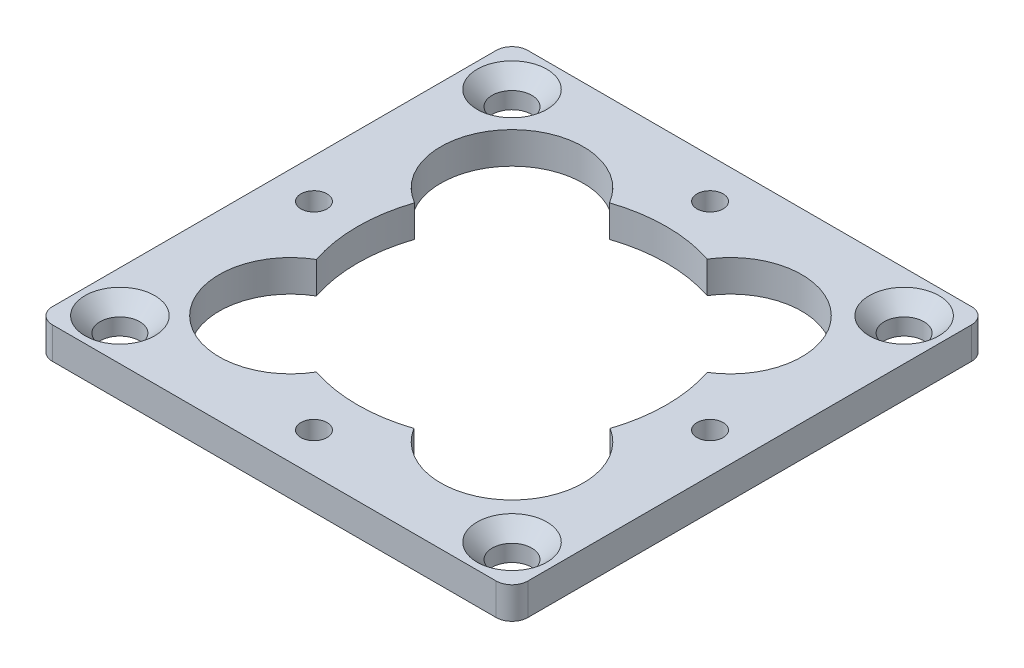
ISO-10303-21;
HEADER;
FILE_DESCRIPTION(('STEP AP214'),'2;1');
FILE_NAME('part.step','',(''),(''),'','','');
FILE_SCHEMA(('AUTOMOTIVE_DESIGN { 1 0 10303 214 1 1 1 1 }'));
ENDSEC;
DATA;
#1=APPLICATION_CONTEXT('core data for automotive mechanical design processes');
#2=APPLICATION_PROTOCOL_DEFINITION('international standard','automotive_design',2000,#1);
#3=PRODUCT_CONTEXT('',#1,'mechanical');
#4=PRODUCT('Part','Part','',(#3));
#5=PRODUCT_RELATED_PRODUCT_CATEGORY('part','',(#4));
#6=PRODUCT_DEFINITION_FORMATION('','',#4);
#7=PRODUCT_DEFINITION_CONTEXT('part definition',#1,'design');
#8=PRODUCT_DEFINITION('design','',#6,#7);
#9=PRODUCT_DEFINITION_SHAPE('','',#8);
#10=(LENGTH_UNIT() NAMED_UNIT(*) SI_UNIT(.MILLI.,.METRE.));
#11=(NAMED_UNIT(*) PLANE_ANGLE_UNIT() SI_UNIT($,.RADIAN.));
#12=(NAMED_UNIT(*) SI_UNIT($,.STERADIAN.) SOLID_ANGLE_UNIT());
#13=UNCERTAINTY_MEASURE_WITH_UNIT(LENGTH_MEASURE(1.E-05),#10,'distance_accuracy_value','');
#14=(GEOMETRIC_REPRESENTATION_CONTEXT(3) GLOBAL_UNCERTAINTY_ASSIGNED_CONTEXT((#13)) GLOBAL_UNIT_ASSIGNED_CONTEXT((#10,
#11,#12)) REPRESENTATION_CONTEXT('',''));
#15=CARTESIAN_POINT('',(0.,0.,0.));
#16=DIRECTION('',(0.,0.,1.));
#17=DIRECTION('',(1.,0.,0.));
#18=AXIS2_PLACEMENT_3D('',#15,#16,#17);
#19=CARTESIAN_POINT('',(-38.705299467486,4.,26.2189672025911));
#20=DIRECTION('',(0.,1.,0.));
#21=DIRECTION('',(0.,0.,1.));
#22=AXIS2_PLACEMENT_3D('',#19,#20,#21);
#23=PLANE('',#22);
#24=CARTESIAN_POINT('',(16.0434378740432,4.,20.9677045441202));
#25=DIRECTION('',(0.,1.,0.));
#26=DIRECTION('',(0.,0.,1.));
#27=AXIS2_PLACEMENT_3D('',#24,#25,#26);
#28=CIRCLE('',#27,4.39999999999999);
#29=CARTESIAN_POINT('',(16.0434378740432,4.,25.3677045441202));
#30=VERTEX_POINT('',#29);
#31=EDGE_CURVE('E300',#30,#30,#28,.F.);
#32=ORIENTED_EDGE('',*,*,#31,.T.);
#33=EDGE_LOOP('',(#32));
#34=FACE_BOUND('',#33,.T.);
#35=CARTESIAN_POINT('',(16.0434378740432,4.,-28.529770138938));
#36=DIRECTION('',(0.,1.,0.));
#37=DIRECTION('',(0.,0.,1.));
#38=AXIS2_PLACEMENT_3D('',#35,#36,#37);
#39=CIRCLE('',#38,4.40000000000001);
#40=CARTESIAN_POINT('',(16.0434378740432,4.,-24.129770138938));
#41=VERTEX_POINT('',#40);
#42=EDGE_CURVE('E297',#41,#41,#39,.F.);
#43=ORIENTED_EDGE('',*,*,#42,.T.);
#44=EDGE_LOOP('',(#43));
#45=FACE_BOUND('',#44,.T.);
#46=CARTESIAN_POINT('',(-33.4540368090152,4.,20.9677045441202));
#47=DIRECTION('',(0.,1.,0.));
#48=DIRECTION('',(0.,0.,1.));
#49=AXIS2_PLACEMENT_3D('',#46,#47,#48);
#50=CIRCLE('',#49,4.39999999999999);
#51=CARTESIAN_POINT('',(-33.4540368090152,4.,25.3677045441202));
#52=VERTEX_POINT('',#51);
#53=EDGE_CURVE('E294',#52,#52,#50,.F.);
#54=ORIENTED_EDGE('',*,*,#53,.T.);
#55=EDGE_LOOP('',(#54));
#56=FACE_BOUND('',#55,.T.);
#57=CARTESIAN_POINT('',(-33.4540368090153,4.,-28.529770138938));
#58=DIRECTION('',(0.,1.,0.));
#59=DIRECTION('',(0.,0.,1.));
#60=AXIS2_PLACEMENT_3D('',#57,#58,#59);
#61=CIRCLE('',#60,4.4);
#62=CARTESIAN_POINT('',(-33.4540368090153,4.,-24.129770138938));
#63=VERTEX_POINT('',#62);
#64=EDGE_CURVE('E291',#63,#63,#61,.F.);
#65=ORIENTED_EDGE('',*,*,#64,.T.);
#66=EDGE_LOOP('',(#65));
#67=FACE_BOUND('',#66,.T.);
#68=CARTESIAN_POINT('',(-8.70529946748604,4.,-28.7810327974089));
#69=DIRECTION('',(0.,1.,0.));
#70=DIRECTION('',(0.,0.,1.));
#71=AXIS2_PLACEMENT_3D('',#68,#69,#70);
#72=CIRCLE('',#71,1.65);
#73=CARTESIAN_POINT('',(-8.70529946748604,4.,-27.1310327974089));
#74=VERTEX_POINT('',#73);
#75=EDGE_CURVE('E410',#74,#74,#72,.T.);
#76=ORIENTED_EDGE('',*,*,#75,.F.);
#77=EDGE_LOOP('',(#76));
#78=FACE_BOUND('',#77,.T.);
#79=CARTESIAN_POINT('',(-33.705299467486,4.,-3.78103279740888));
#80=DIRECTION('',(0.,1.,0.));
#81=DIRECTION('',(0.,0.,1.));
#82=AXIS2_PLACEMENT_3D('',#79,#80,#81);
#83=CIRCLE('',#82,1.65);
#84=CARTESIAN_POINT('',(-33.705299467486,4.,-2.13103279740888));
#85=VERTEX_POINT('',#84);
#86=EDGE_CURVE('E191',#85,#85,#83,.T.);
#87=ORIENTED_EDGE('',*,*,#86,.F.);
#88=EDGE_LOOP('',(#87));
#89=FACE_BOUND('',#88,.T.);
#90=DIRECTION('',(-1.,0.,0.));
#91=VECTOR('',#90,1.);
#92=CARTESIAN_POINT('',(-38.705299467486,4.,-33.7810327974089));
#93=LINE('',#92,#91);
#94=CARTESIAN_POINT('',(19.2947005325139,4.,-33.7810327974089));
#95=VERTEX_POINT('',#94);
#96=CARTESIAN_POINT('',(-36.705299467486,4.,-33.7810327974089));
#97=VERTEX_POINT('',#96);
#98=EDGE_CURVE('E242',#95,#97,#93,.T.);
#99=ORIENTED_EDGE('',*,*,#98,.T.);
#100=CARTESIAN_POINT('',(-36.705299467486,4.,-31.7810327974089));
#101=DIRECTION('',(0.,1.,0.));
#102=DIRECTION('',(0.,0.,1.));
#103=AXIS2_PLACEMENT_3D('',#100,#101,#102);
#104=CIRCLE('',#103,2.);
#105=CARTESIAN_POINT('',(-38.705299467486,4.,-31.7810327974089));
#106=VERTEX_POINT('',#105);
#107=EDGE_CURVE('E277',#97,#106,#104,.T.);
#108=ORIENTED_EDGE('',*,*,#107,.T.);
#109=DIRECTION('',(0.,0.,1.));
#110=VECTOR('',#109,1.);
#111=CARTESIAN_POINT('',(-38.705299467486,4.,-33.7810327974089));
#112=LINE('',#111,#110);
#113=CARTESIAN_POINT('',(-38.705299467486,4.,24.2189672025911));
#114=VERTEX_POINT('',#113);
#115=EDGE_CURVE('E234',#106,#114,#112,.T.);
#116=ORIENTED_EDGE('',*,*,#115,.T.);
#117=CARTESIAN_POINT('',(-36.705299467486,4.,24.2189672025911));
#118=DIRECTION('',(0.,1.,0.));
#119=DIRECTION('',(0.,0.,1.));
#120=AXIS2_PLACEMENT_3D('',#117,#118,#119);
#121=CIRCLE('',#120,2.);
#122=CARTESIAN_POINT('',(-36.705299467486,4.,26.2189672025911));
#123=VERTEX_POINT('',#122);
#124=EDGE_CURVE('E272',#114,#123,#121,.T.);
#125=ORIENTED_EDGE('',*,*,#124,.T.);
#126=DIRECTION('',(1.,0.,0.));
#127=VECTOR('',#126,1.);
#128=CARTESIAN_POINT('',(-38.705299467486,4.,26.2189672025911));
#129=LINE('',#128,#127);
#130=CARTESIAN_POINT('',(19.294700532514,4.,26.2189672025911));
#131=VERTEX_POINT('',#130);
#132=EDGE_CURVE('E237',#123,#131,#129,.T.);
#133=ORIENTED_EDGE('',*,*,#132,.T.);
#134=CARTESIAN_POINT('',(19.294700532514,4.,24.2189672025911));
#135=DIRECTION('',(0.,1.,0.));
#136=DIRECTION('',(0.,0.,1.));
#137=AXIS2_PLACEMENT_3D('',#134,#135,#136);
#138=CIRCLE('',#137,2.);
#139=CARTESIAN_POINT('',(21.294700532514,4.,24.2189672025911));
#140=VERTEX_POINT('',#139);
#141=EDGE_CURVE('E55',#131,#140,#138,.T.);
#142=ORIENTED_EDGE('',*,*,#141,.T.);
#143=DIRECTION('',(0.,0.,-1.));
#144=VECTOR('',#143,1.);
#145=CARTESIAN_POINT('',(21.294700532514,4.,-33.7810327974089));
#146=LINE('',#145,#144);
#147=CARTESIAN_POINT('',(21.294700532514,4.,-31.7810327974089));
#148=VERTEX_POINT('',#147);
#149=EDGE_CURVE('E240',#140,#148,#146,.T.);
#150=ORIENTED_EDGE('',*,*,#149,.T.);
#151=CARTESIAN_POINT('',(19.2947005325139,4.,-31.7810327974089));
#152=DIRECTION('',(0.,1.,0.));
#153=DIRECTION('',(0.,0.,1.));
#154=AXIS2_PLACEMENT_3D('',#151,#152,#153);
#155=CIRCLE('',#154,2.);
#156=EDGE_CURVE('E275',#148,#95,#155,.T.);
#157=ORIENTED_EDGE('',*,*,#156,.T.);
#158=EDGE_LOOP('',(#99,#108,#116,#125,#133,#142,#150,#157));
#159=FACE_BOUND('',#158,.T.);
#160=CARTESIAN_POINT('',(-22.6886835294264,4.,-17.764416859349));
#161=DIRECTION('',(0.,1.,0.));
#162=DIRECTION('',(0.,0.,1.));
#163=AXIS2_PLACEMENT_3D('',#160,#161,#162);
#164=CIRCLE('',#163,9.);
#165=CARTESIAN_POINT('',(-14.8984999863531,4.,-22.2714159014201));
#166=VERTEX_POINT('',#165);
#167=CARTESIAN_POINT('',(-27.1956825714974,4.,-9.97423331627569));
#168=VERTEX_POINT('',#167);
#169=EDGE_CURVE('E159',#166,#168,#164,.T.);
#170=ORIENTED_EDGE('',*,*,#169,.F.);
#171=CARTESIAN_POINT('',(-8.70529946748604,4.,-3.78103279740888));
#172=DIRECTION('',(0.,1.,0.));
#173=DIRECTION('',(0.,0.,1.));
#174=AXIS2_PLACEMENT_3D('',#171,#172,#173);
#175=CIRCLE('',#174,19.5);
#176=CARTESIAN_POINT('',(-2.57751187142757,4.,-22.2931968842355));
#177=VERTEX_POINT('',#176);
#178=EDGE_CURVE('E149',#177,#166,#175,.T.);
#179=ORIENTED_EDGE('',*,*,#178,.F.);
#180=CARTESIAN_POINT('',(5.08328276565161,4.,-17.5696150305466));
#181=DIRECTION('',(0.,1.,0.));
#182=DIRECTION('',(0.,0.,1.));
#183=AXIS2_PLACEMENT_3D('',#180,#181,#182);
#184=CIRCLE('',#183,9.);
#185=CARTESIAN_POINT('',(9.80686461934051,4.,-9.90882039346742));
#186=VERTEX_POINT('',#185);
#187=EDGE_CURVE('E187',#186,#177,#184,.T.);
#188=ORIENTED_EDGE('',*,*,#187,.F.);
#189=CARTESIAN_POINT('',(-8.70529946748604,4.,-3.78103279740888));
#190=DIRECTION('',(0.,1.,0.));
#191=DIRECTION('',(0.,0.,1.));
#192=AXIS2_PLACEMENT_3D('',#189,#190,#191);
#193=CIRCLE('',#192,19.5);
#194=CARTESIAN_POINT('',(9.80686461934056,4.,2.34675479864952));
#195=VERTEX_POINT('',#194);
#196=EDGE_CURVE('E184',#195,#186,#193,.T.);
#197=ORIENTED_EDGE('',*,*,#196,.F.);
#198=CARTESIAN_POINT('',(5.08328276565171,4.,10.0075494357287));
#199=DIRECTION('',(0.,1.,0.));
#200=DIRECTION('',(0.,0.,1.));
#201=AXIS2_PLACEMENT_3D('',#198,#199,#200);
#202=CIRCLE('',#201,9.);
#203=CARTESIAN_POINT('',(-2.57751187142744,4.,14.7311312894177));
#204=VERTEX_POINT('',#203);
#205=EDGE_CURVE('E182',#204,#195,#202,.T.);
#206=ORIENTED_EDGE('',*,*,#205,.F.);
#207=CARTESIAN_POINT('',(-8.70529946748604,4.,-3.78103279740888));
#208=DIRECTION('',(0.,1.,0.));
#209=DIRECTION('',(0.,0.,1.));
#210=AXIS2_PLACEMENT_3D('',#207,#208,#209);
#211=CIRCLE('',#210,19.5);
#212=CARTESIAN_POINT('',(-14.8984999863529,4.,14.7093503066024));
#213=VERTEX_POINT('',#212);
#214=EDGE_CURVE('E180',#213,#204,#211,.T.);
#215=ORIENTED_EDGE('',*,*,#214,.F.);
#216=CARTESIAN_POINT('',(-22.6886835294263,4.,10.2023512645314));
#217=DIRECTION('',(0.,1.,0.));
#218=DIRECTION('',(0.,0.,1.));
#219=AXIS2_PLACEMENT_3D('',#216,#217,#218);
#220=CIRCLE('',#219,9.);
#221=CARTESIAN_POINT('',(-27.1956825714973,4.,2.41216772145806));
#222=VERTEX_POINT('',#221);
#223=EDGE_CURVE('E175',#222,#213,#220,.T.);
#224=ORIENTED_EDGE('',*,*,#223,.F.);
#225=CARTESIAN_POINT('',(-8.70529946748604,4.,-3.78103279740888));
#226=DIRECTION('',(0.,1.,0.));
#227=DIRECTION('',(0.,0.,1.));
#228=AXIS2_PLACEMENT_3D('',#225,#226,#227);
#229=CIRCLE('',#228,19.5);
#230=EDGE_CURVE('E173',#168,#222,#229,.T.);
#231=ORIENTED_EDGE('',*,*,#230,.F.);
#232=EDGE_LOOP('',(#170,#179,#188,#197,#206,#215,#224,#231));
#233=FACE_BOUND('',#232,.T.);
#234=CARTESIAN_POINT('',(16.294700532514,4.,-3.78103279740888));
#235=DIRECTION('',(0.,1.,0.));
#236=DIRECTION('',(0.,0.,1.));
#237=AXIS2_PLACEMENT_3D('',#234,#235,#236);
#238=CIRCLE('',#237,1.65);
#239=CARTESIAN_POINT('',(16.294700532514,4.,-2.13103279740888));
#240=VERTEX_POINT('',#239);
#241=EDGE_CURVE('E415',#240,#240,#238,.T.);
#242=ORIENTED_EDGE('',*,*,#241,.F.);
#243=EDGE_LOOP('',(#242));
#244=FACE_BOUND('',#243,.T.);
#245=CARTESIAN_POINT('',(-8.70529946748604,4.,21.2189672025911));
#246=DIRECTION('',(0.,1.,0.));
#247=DIRECTION('',(0.,0.,1.));
#248=AXIS2_PLACEMENT_3D('',#245,#246,#247);
#249=CIRCLE('',#248,1.65);
#250=CARTESIAN_POINT('',(-8.70529946748604,4.,22.8689672025911));
#251=VERTEX_POINT('',#250);
#252=EDGE_CURVE('E404',#251,#251,#249,.T.);
#253=ORIENTED_EDGE('',*,*,#252,.F.);
#254=EDGE_LOOP('',(#253));
#255=FACE_BOUND('',#254,.T.);
#256=ADVANCED_FACE('F33',(#34,#45,#56,#67,#78,#89,#159,#233,#244,#255),#23,.T.);
#257=CARTESIAN_POINT('',(-38.705299467486,0.,26.2189672025911));
#258=DIRECTION('',(0.,1.,0.));
#259=DIRECTION('',(0.,0.,1.));
#260=AXIS2_PLACEMENT_3D('',#257,#258,#259);
#261=PLANE('',#260);
#262=CARTESIAN_POINT('',(-8.70529946748604,0.,-28.7810327974089));
#263=DIRECTION('',(0.,1.,0.));
#264=DIRECTION('',(0.,0.,1.));
#265=AXIS2_PLACEMENT_3D('',#262,#263,#264);
#266=CIRCLE('',#265,1.65);
#267=CARTESIAN_POINT('',(-8.70529946748604,0.,-27.1310327974089));
#268=VERTEX_POINT('',#267);
#269=EDGE_CURVE('E407',#268,#268,#266,.T.);
#270=ORIENTED_EDGE('',*,*,#269,.T.);
#271=EDGE_LOOP('',(#270));
#272=FACE_BOUND('',#271,.T.);
#273=CARTESIAN_POINT('',(-33.705299467486,0.,-3.78103279740888));
#274=DIRECTION('',(0.,1.,0.));
#275=DIRECTION('',(0.,0.,1.));
#276=AXIS2_PLACEMENT_3D('',#273,#274,#275);
#277=CIRCLE('',#276,1.65);
#278=CARTESIAN_POINT('',(-33.705299467486,0.,-2.13103279740888));
#279=VERTEX_POINT('',#278);
#280=EDGE_CURVE('E418',#279,#279,#277,.T.);
#281=ORIENTED_EDGE('',*,*,#280,.T.);
#282=EDGE_LOOP('',(#281));
#283=FACE_BOUND('',#282,.T.);
#284=CARTESIAN_POINT('',(16.0434378740432,0.,20.9677045441202));
#285=DIRECTION('',(0.,1.,0.));
#286=DIRECTION('',(0.,0.,1.));
#287=AXIS2_PLACEMENT_3D('',#284,#285,#286);
#288=CIRCLE('',#287,2.49999999999999);
#289=CARTESIAN_POINT('',(16.0434378740432,0.,23.4677045441202));
#290=VERTEX_POINT('',#289);
#291=EDGE_CURVE('E167',#290,#290,#288,.T.);
#292=ORIENTED_EDGE('',*,*,#291,.T.);
#293=EDGE_LOOP('',(#292));
#294=FACE_BOUND('',#293,.T.);
#295=CARTESIAN_POINT('',(16.0434378740432,0.,-28.529770138938));
#296=DIRECTION('',(0.,1.,0.));
#297=DIRECTION('',(0.,0.,1.));
#298=AXIS2_PLACEMENT_3D('',#295,#296,#297);
#299=CIRCLE('',#298,2.50000000000001);
#300=CARTESIAN_POINT('',(16.0434378740432,0.,-26.029770138938));
#301=VERTEX_POINT('',#300);
#302=EDGE_CURVE('E227',#301,#301,#299,.T.);
#303=ORIENTED_EDGE('',*,*,#302,.T.);
#304=EDGE_LOOP('',(#303));
#305=FACE_BOUND('',#304,.T.);
#306=DIRECTION('',(0.,0.,1.));
#307=VECTOR('',#306,1.);
#308=CARTESIAN_POINT('',(-38.705299467486,0.,-33.7810327974089));
#309=LINE('',#308,#307);
#310=CARTESIAN_POINT('',(-38.705299467486,0.,-31.7810327974089));
#311=VERTEX_POINT('',#310);
#312=CARTESIAN_POINT('',(-38.705299467486,0.,24.2189672025911));
#313=VERTEX_POINT('',#312);
#314=EDGE_CURVE('E233',#311,#313,#309,.T.);
#315=ORIENTED_EDGE('',*,*,#314,.F.);
#316=CARTESIAN_POINT('',(-36.705299467486,0.,-31.7810327974089));
#317=DIRECTION('',(0.,1.,0.));
#318=DIRECTION('',(0.,0.,1.));
#319=AXIS2_PLACEMENT_3D('',#316,#317,#318);
#320=CIRCLE('',#319,2.);
#321=CARTESIAN_POINT('',(-36.705299467486,0.,-33.7810327974089));
#322=VERTEX_POINT('',#321);
#323=EDGE_CURVE('E265',#311,#322,#320,.F.);
#324=ORIENTED_EDGE('',*,*,#323,.T.);
#325=DIRECTION('',(-1.,0.,0.));
#326=VECTOR('',#325,1.);
#327=CARTESIAN_POINT('',(-38.705299467486,0.,-33.7810327974089));
#328=LINE('',#327,#326);
#329=CARTESIAN_POINT('',(19.2947005325139,0.,-33.7810327974089));
#330=VERTEX_POINT('',#329);
#331=EDGE_CURVE('E238',#330,#322,#328,.T.);
#332=ORIENTED_EDGE('',*,*,#331,.F.);
#333=CARTESIAN_POINT('',(19.2947005325139,0.,-31.7810327974089));
#334=DIRECTION('',(0.,1.,0.));
#335=DIRECTION('',(0.,0.,1.));
#336=AXIS2_PLACEMENT_3D('',#333,#334,#335);
#337=CIRCLE('',#336,2.);
#338=CARTESIAN_POINT('',(21.294700532514,0.,-31.7810327974089));
#339=VERTEX_POINT('',#338);
#340=EDGE_CURVE('E263',#330,#339,#337,.F.);
#341=ORIENTED_EDGE('',*,*,#340,.T.);
#342=DIRECTION('',(0.,0.,-1.));
#343=VECTOR('',#342,1.);
#344=CARTESIAN_POINT('',(21.294700532514,0.,-33.7810327974089));
#345=LINE('',#344,#343);
#346=CARTESIAN_POINT('',(21.294700532514,0.,24.2189672025911));
#347=VERTEX_POINT('',#346);
#348=EDGE_CURVE('E251',#347,#339,#345,.T.);
#349=ORIENTED_EDGE('',*,*,#348,.F.);
#350=CARTESIAN_POINT('',(19.294700532514,0.,24.2189672025911));
#351=DIRECTION('',(0.,1.,0.));
#352=DIRECTION('',(0.,0.,1.));
#353=AXIS2_PLACEMENT_3D('',#350,#351,#352);
#354=CIRCLE('',#353,2.);
#355=CARTESIAN_POINT('',(19.294700532514,0.,26.2189672025911));
#356=VERTEX_POINT('',#355);
#357=EDGE_CURVE('E261',#347,#356,#354,.F.);
#358=ORIENTED_EDGE('',*,*,#357,.T.);
#359=DIRECTION('',(1.,0.,0.));
#360=VECTOR('',#359,1.);
#361=CARTESIAN_POINT('',(-38.705299467486,0.,26.2189672025911));
#362=LINE('',#361,#360);
#363=CARTESIAN_POINT('',(-36.705299467486,0.,26.2189672025911));
#364=VERTEX_POINT('',#363);
#365=EDGE_CURVE('E248',#364,#356,#362,.T.);
#366=ORIENTED_EDGE('',*,*,#365,.F.);
#367=CARTESIAN_POINT('',(-36.705299467486,0.,24.2189672025911));
#368=DIRECTION('',(0.,1.,0.));
#369=DIRECTION('',(0.,0.,1.));
#370=AXIS2_PLACEMENT_3D('',#367,#368,#369);
#371=CIRCLE('',#370,2.);
#372=EDGE_CURVE('E259',#364,#313,#371,.F.);
#373=ORIENTED_EDGE('',*,*,#372,.T.);
#374=EDGE_LOOP('',(#315,#324,#332,#341,#349,#358,#366,#373));
#375=FACE_BOUND('',#374,.T.);
#376=CARTESIAN_POINT('',(-33.4540368090153,0.,-28.529770138938));
#377=DIRECTION('',(0.,1.,0.));
#378=DIRECTION('',(0.,0.,1.));
#379=AXIS2_PLACEMENT_3D('',#376,#377,#378);
#380=CIRCLE('',#379,2.5);
#381=CARTESIAN_POINT('',(-33.4540368090153,0.,-26.029770138938));
#382=VERTEX_POINT('',#381);
#383=EDGE_CURVE('E230',#382,#382,#380,.T.);
#384=ORIENTED_EDGE('',*,*,#383,.T.);
#385=EDGE_LOOP('',(#384));
#386=FACE_BOUND('',#385,.T.);
#387=CARTESIAN_POINT('',(-33.4540368090152,0.,20.9677045441202));
#388=DIRECTION('',(0.,1.,0.));
#389=DIRECTION('',(0.,0.,1.));
#390=AXIS2_PLACEMENT_3D('',#387,#388,#389);
#391=CIRCLE('',#390,2.49999999999999);
#392=CARTESIAN_POINT('',(-33.4540368090152,0.,23.4677045441202));
#393=VERTEX_POINT('',#392);
#394=EDGE_CURVE('E224',#393,#393,#391,.T.);
#395=ORIENTED_EDGE('',*,*,#394,.T.);
#396=EDGE_LOOP('',(#395));
#397=FACE_BOUND('',#396,.T.);
#398=CARTESIAN_POINT('',(-8.70529946748604,0.,-3.78103279740888));
#399=DIRECTION('',(0.,1.,0.));
#400=DIRECTION('',(0.,0.,1.));
#401=AXIS2_PLACEMENT_3D('',#398,#399,#400);
#402=CIRCLE('',#401,19.5);
#403=CARTESIAN_POINT('',(-2.57751187142757,0.,-22.2931968842355));
#404=VERTEX_POINT('',#403);
#405=CARTESIAN_POINT('',(-14.8984999863531,0.,-22.2714159014201));
#406=VERTEX_POINT('',#405);
#407=EDGE_CURVE('E189',#404,#406,#402,.T.);
#408=ORIENTED_EDGE('',*,*,#407,.T.);
#409=CARTESIAN_POINT('',(-22.6886835294264,0.,-17.764416859349));
#410=DIRECTION('',(0.,1.,0.));
#411=DIRECTION('',(0.,0.,1.));
#412=AXIS2_PLACEMENT_3D('',#409,#410,#411);
#413=CIRCLE('',#412,9.);
#414=CARTESIAN_POINT('',(-27.1956825714974,0.,-9.97423331627569));
#415=VERTEX_POINT('',#414);
#416=EDGE_CURVE('E166',#406,#415,#413,.T.);
#417=ORIENTED_EDGE('',*,*,#416,.T.);
#418=CARTESIAN_POINT('',(-8.70529946748604,0.,-3.78103279740888));
#419=DIRECTION('',(0.,1.,0.));
#420=DIRECTION('',(0.,0.,1.));
#421=AXIS2_PLACEMENT_3D('',#418,#419,#420);
#422=CIRCLE('',#421,19.5);
#423=CARTESIAN_POINT('',(-27.1956825714973,0.,2.41216772145806));
#424=VERTEX_POINT('',#423);
#425=EDGE_CURVE('E193',#415,#424,#422,.T.);
#426=ORIENTED_EDGE('',*,*,#425,.T.);
#427=CARTESIAN_POINT('',(-22.6886835294263,0.,10.2023512645314));
#428=DIRECTION('',(0.,1.,0.));
#429=DIRECTION('',(0.,0.,1.));
#430=AXIS2_PLACEMENT_3D('',#427,#428,#429);
#431=CIRCLE('',#430,9.);
#432=CARTESIAN_POINT('',(-14.8984999863529,0.,14.7093503066024));
#433=VERTEX_POINT('',#432);
#434=EDGE_CURVE('E196',#424,#433,#431,.T.);
#435=ORIENTED_EDGE('',*,*,#434,.T.);
#436=CARTESIAN_POINT('',(-8.70529946748604,0.,-3.78103279740888));
#437=DIRECTION('',(0.,1.,0.));
#438=DIRECTION('',(0.,0.,1.));
#439=AXIS2_PLACEMENT_3D('',#436,#437,#438);
#440=CIRCLE('',#439,19.5);
#441=CARTESIAN_POINT('',(-2.57751187142744,0.,14.7311312894177));
#442=VERTEX_POINT('',#441);
#443=EDGE_CURVE('E199',#433,#442,#440,.T.);
#444=ORIENTED_EDGE('',*,*,#443,.T.);
#445=CARTESIAN_POINT('',(5.08328276565171,0.,10.0075494357287));
#446=DIRECTION('',(0.,1.,0.));
#447=DIRECTION('',(0.,0.,1.));
#448=AXIS2_PLACEMENT_3D('',#445,#446,#447);
#449=CIRCLE('',#448,9.);
#450=CARTESIAN_POINT('',(9.80686461934056,0.,2.34675479864952));
#451=VERTEX_POINT('',#450);
#452=EDGE_CURVE('E202',#442,#451,#449,.T.);
#453=ORIENTED_EDGE('',*,*,#452,.T.);
#454=CARTESIAN_POINT('',(-8.70529946748604,0.,-3.78103279740888));
#455=DIRECTION('',(0.,1.,0.));
#456=DIRECTION('',(0.,0.,1.));
#457=AXIS2_PLACEMENT_3D('',#454,#455,#456);
#458=CIRCLE('',#457,19.5);
#459=CARTESIAN_POINT('',(9.80686461934051,0.,-9.90882039346742));
#460=VERTEX_POINT('',#459);
#461=EDGE_CURVE('E205',#451,#460,#458,.T.);
#462=ORIENTED_EDGE('',*,*,#461,.T.);
#463=CARTESIAN_POINT('',(5.08328276565161,0.,-17.5696150305466));
#464=DIRECTION('',(0.,1.,0.));
#465=DIRECTION('',(0.,0.,1.));
#466=AXIS2_PLACEMENT_3D('',#463,#464,#465);
#467=CIRCLE('',#466,9.);
#468=EDGE_CURVE('E160',#460,#404,#467,.T.);
#469=ORIENTED_EDGE('',*,*,#468,.T.);
#470=EDGE_LOOP('',(#408,#417,#426,#435,#444,#453,#462,#469));
#471=FACE_BOUND('',#470,.T.);
#472=CARTESIAN_POINT('',(16.294700532514,0.,-3.78103279740888));
#473=DIRECTION('',(0.,1.,0.));
#474=DIRECTION('',(0.,0.,1.));
#475=AXIS2_PLACEMENT_3D('',#472,#473,#474);
#476=CIRCLE('',#475,1.65);
#477=CARTESIAN_POINT('',(16.294700532514,0.,-2.13103279740888));
#478=VERTEX_POINT('',#477);
#479=EDGE_CURVE('E399',#478,#478,#476,.T.);
#480=ORIENTED_EDGE('',*,*,#479,.T.);
#481=EDGE_LOOP('',(#480));
#482=FACE_BOUND('',#481,.T.);
#483=CARTESIAN_POINT('',(-8.70529946748604,0.,21.2189672025911));
#484=DIRECTION('',(0.,1.,0.));
#485=DIRECTION('',(0.,0.,1.));
#486=AXIS2_PLACEMENT_3D('',#483,#484,#485);
#487=CIRCLE('',#486,1.65);
#488=CARTESIAN_POINT('',(-8.70529946748604,0.,22.8689672025911));
#489=VERTEX_POINT('',#488);
#490=EDGE_CURVE('E402',#489,#489,#487,.T.);
#491=ORIENTED_EDGE('',*,*,#490,.T.);
#492=EDGE_LOOP('',(#491));
#493=FACE_BOUND('',#492,.T.);
#494=ADVANCED_FACE('F325',(#272,#283,#294,#305,#375,#386,#397,#471,#482,#493),#261,.F.);
#495=CARTESIAN_POINT('',(-38.705299467486,4.,-33.7810327974089));
#496=DIRECTION('',(1.,0.,0.));
#497=DIRECTION('',(0.,0.,-1.));
#498=AXIS2_PLACEMENT_3D('',#495,#496,#497);
#499=PLANE('',#498);
#500=ORIENTED_EDGE('',*,*,#115,.F.);
#501=DIRECTION('',(0.,-1.,0.));
#502=VECTOR('',#501,1.);
#503=CARTESIAN_POINT('',(-38.705299467486,4.,-31.7810327974089));
#504=LINE('',#503,#502);
#505=EDGE_CURVE('E256',#106,#311,#504,.T.);
#506=ORIENTED_EDGE('',*,*,#505,.T.);
#507=ORIENTED_EDGE('',*,*,#314,.T.);
#508=DIRECTION('',(0.,-1.,0.));
#509=VECTOR('',#508,1.);
#510=CARTESIAN_POINT('',(-38.705299467486,4.,24.2189672025911));
#511=LINE('',#510,#509);
#512=EDGE_CURVE('E245',#313,#114,#511,.F.);
#513=ORIENTED_EDGE('',*,*,#512,.T.);
#514=EDGE_LOOP('',(#500,#506,#507,#513));
#515=FACE_BOUND('',#514,.T.);
#516=ADVANCED_FACE('F333',(#515),#499,.F.);
#517=CARTESIAN_POINT('',(-38.705299467486,4.,26.2189672025911));
#518=DIRECTION('',(0.,0.,-1.));
#519=DIRECTION('',(-1.,0.,0.));
#520=AXIS2_PLACEMENT_3D('',#517,#518,#519);
#521=PLANE('',#520);
#522=ORIENTED_EDGE('',*,*,#365,.T.);
#523=DIRECTION('',(0.,-1.,0.));
#524=VECTOR('',#523,1.);
#525=CARTESIAN_POINT('',(19.294700532514,4.,26.2189672025911));
#526=LINE('',#525,#524);
#527=EDGE_CURVE('E286',#356,#131,#526,.F.);
#528=ORIENTED_EDGE('',*,*,#527,.T.);
#529=ORIENTED_EDGE('',*,*,#132,.F.);
#530=DIRECTION('',(0.,-1.,0.));
#531=VECTOR('',#530,1.);
#532=CARTESIAN_POINT('',(-36.705299467486,4.,26.2189672025911));
#533=LINE('',#532,#531);
#534=EDGE_CURVE('E283',#123,#364,#533,.T.);
#535=ORIENTED_EDGE('',*,*,#534,.T.);
#536=EDGE_LOOP('',(#522,#528,#529,#535));
#537=FACE_BOUND('',#536,.T.);
#538=ADVANCED_FACE('F348',(#537),#521,.F.);
#539=CARTESIAN_POINT('',(21.294700532514,4.,-33.7810327974089));
#540=DIRECTION('',(-1.,0.,0.));
#541=DIRECTION('',(0.,0.,1.));
#542=AXIS2_PLACEMENT_3D('',#539,#540,#541);
#543=PLANE('',#542);
#544=ORIENTED_EDGE('',*,*,#348,.T.);
#545=DIRECTION('',(0.,-1.,0.));
#546=VECTOR('',#545,1.);
#547=CARTESIAN_POINT('',(21.294700532514,4.,-31.7810327974089));
#548=LINE('',#547,#546);
#549=EDGE_CURVE('E48',#339,#148,#548,.F.);
#550=ORIENTED_EDGE('',*,*,#549,.T.);
#551=ORIENTED_EDGE('',*,*,#149,.F.);
#552=DIRECTION('',(0.,-1.,0.));
#553=VECTOR('',#552,1.);
#554=CARTESIAN_POINT('',(21.294700532514,4.,24.2189672025911));
#555=LINE('',#554,#553);
#556=EDGE_CURVE('E279',#140,#347,#555,.T.);
#557=ORIENTED_EDGE('',*,*,#556,.T.);
#558=EDGE_LOOP('',(#544,#550,#551,#557));
#559=FACE_BOUND('',#558,.T.);
#560=ADVANCED_FACE('F344',(#559),#543,.F.);
#561=CARTESIAN_POINT('',(-38.705299467486,4.,-33.7810327974089));
#562=DIRECTION('',(0.,0.,1.));
#563=DIRECTION('',(1.,0.,0.));
#564=AXIS2_PLACEMENT_3D('',#561,#562,#563);
#565=PLANE('',#564);
#566=ORIENTED_EDGE('',*,*,#331,.T.);
#567=DIRECTION('',(0.,-1.,0.));
#568=VECTOR('',#567,1.);
#569=CARTESIAN_POINT('',(-36.705299467486,4.,-33.7810327974089));
#570=LINE('',#569,#568);
#571=EDGE_CURVE('E270',#322,#97,#570,.F.);
#572=ORIENTED_EDGE('',*,*,#571,.T.);
#573=ORIENTED_EDGE('',*,*,#98,.F.);
#574=DIRECTION('',(0.,-1.,0.));
#575=VECTOR('',#574,1.);
#576=CARTESIAN_POINT('',(19.2947005325139,4.,-33.7810327974089));
#577=LINE('',#576,#575);
#578=EDGE_CURVE('E267',#95,#330,#577,.T.);
#579=ORIENTED_EDGE('',*,*,#578,.T.);
#580=EDGE_LOOP('',(#566,#572,#573,#579));
#581=FACE_BOUND('',#580,.T.);
#582=ADVANCED_FACE('F341',(#581),#565,.F.);
#583=CARTESIAN_POINT('',(-33.4540368090153,4.,-28.529770138938));
#584=DIRECTION('',(0.,-1.,0.));
#585=DIRECTION('',(0.,0.,-1.));
#586=AXIS2_PLACEMENT_3D('',#583,#584,#585);
#587=CYLINDRICAL_SURFACE('',#586,2.5);
#588=CARTESIAN_POINT('',(-33.4540368090153,2.09999999999999,-28.529770138938));
#589=DIRECTION('',(0.,1.,0.));
#590=DIRECTION('',(0.,0.,1.));
#591=AXIS2_PLACEMENT_3D('',#588,#589,#590);
#592=CIRCLE('',#591,2.5);
#593=CARTESIAN_POINT('',(-33.4540368090153,2.09999999999999,-26.029770138938));
#594=VERTEX_POINT('',#593);
#595=EDGE_CURVE('E11',#594,#594,#592,.T.);
#596=ORIENTED_EDGE('',*,*,#595,.T.);
#597=EDGE_LOOP('',(#596));
#598=FACE_BOUND('',#597,.T.);
#599=ORIENTED_EDGE('',*,*,#383,.F.);
#600=EDGE_LOOP('',(#599));
#601=FACE_BOUND('',#600,.T.);
#602=ADVANCED_FACE('F338',(#598,#601),#587,.F.);
#603=CARTESIAN_POINT('',(16.0434378740432,4.,-28.529770138938));
#604=DIRECTION('',(0.,-1.,0.));
#605=DIRECTION('',(0.,0.,-1.));
#606=AXIS2_PLACEMENT_3D('',#603,#604,#605);
#607=CYLINDRICAL_SURFACE('',#606,2.50000000000001);
#608=CARTESIAN_POINT('',(16.0434378740432,2.1,-28.529770138938));
#609=DIRECTION('',(0.,1.,0.));
#610=DIRECTION('',(0.,0.,1.));
#611=AXIS2_PLACEMENT_3D('',#608,#609,#610);
#612=CIRCLE('',#611,2.50000000000001);
#613=CARTESIAN_POINT('',(16.0434378740432,2.1,-26.029770138938));
#614=VERTEX_POINT('',#613);
#615=EDGE_CURVE('E303',#614,#614,#612,.T.);
#616=ORIENTED_EDGE('',*,*,#615,.T.);
#617=EDGE_LOOP('',(#616));
#618=FACE_BOUND('',#617,.T.);
#619=ORIENTED_EDGE('',*,*,#302,.F.);
#620=EDGE_LOOP('',(#619));
#621=FACE_BOUND('',#620,.T.);
#622=ADVANCED_FACE('F467',(#618,#621),#607,.F.);
#623=CARTESIAN_POINT('',(-33.4540368090152,4.,20.9677045441202));
#624=DIRECTION('',(0.,-1.,0.));
#625=DIRECTION('',(0.,0.,-1.));
#626=AXIS2_PLACEMENT_3D('',#623,#624,#625);
#627=CYLINDRICAL_SURFACE('',#626,2.49999999999999);
#628=CARTESIAN_POINT('',(-33.4540368090152,2.1,20.9677045441202));
#629=DIRECTION('',(0.,1.,0.));
#630=DIRECTION('',(0.,0.,1.));
#631=AXIS2_PLACEMENT_3D('',#628,#629,#630);
#632=CIRCLE('',#631,2.49999999999999);
#633=CARTESIAN_POINT('',(-33.4540368090152,2.1,23.4677045441202));
#634=VERTEX_POINT('',#633);
#635=EDGE_CURVE('E41',#634,#634,#632,.T.);
#636=ORIENTED_EDGE('',*,*,#635,.T.);
#637=EDGE_LOOP('',(#636));
#638=FACE_BOUND('',#637,.T.);
#639=ORIENTED_EDGE('',*,*,#394,.F.);
#640=EDGE_LOOP('',(#639));
#641=FACE_BOUND('',#640,.T.);
#642=ADVANCED_FACE('F308',(#638,#641),#627,.F.);
#643=CARTESIAN_POINT('',(16.0434378740432,4.,20.9677045441202));
#644=DIRECTION('',(0.,-1.,0.));
#645=DIRECTION('',(0.,0.,-1.));
#646=AXIS2_PLACEMENT_3D('',#643,#644,#645);
#647=CYLINDRICAL_SURFACE('',#646,2.49999999999999);
#648=CARTESIAN_POINT('',(16.0434378740432,2.10000000000001,20.9677045441202));
#649=DIRECTION('',(0.,1.,0.));
#650=DIRECTION('',(0.,0.,1.));
#651=AXIS2_PLACEMENT_3D('',#648,#649,#650);
#652=CIRCLE('',#651,2.49999999999999);
#653=CARTESIAN_POINT('',(16.0434378740432,2.10000000000001,23.4677045441202));
#654=VERTEX_POINT('',#653);
#655=EDGE_CURVE('E288',#654,#654,#652,.T.);
#656=ORIENTED_EDGE('',*,*,#655,.T.);
#657=EDGE_LOOP('',(#656));
#658=FACE_BOUND('',#657,.T.);
#659=ORIENTED_EDGE('',*,*,#291,.F.);
#660=EDGE_LOOP('',(#659));
#661=FACE_BOUND('',#660,.T.);
#662=ADVANCED_FACE('F380',(#658,#661),#647,.F.);
#663=CARTESIAN_POINT('',(-8.70529946748604,4.,-3.78103279740888));
#664=DIRECTION('',(0.,-1.,0.));
#665=DIRECTION('',(0.,0.,-1.));
#666=AXIS2_PLACEMENT_3D('',#663,#664,#665);
#667=CYLINDRICAL_SURFACE('',#666,19.5);
#668=ORIENTED_EDGE('',*,*,#407,.F.);
#669=DIRECTION('',(0.,-1.,0.));
#670=VECTOR('',#669,1.);
#671=CARTESIAN_POINT('',(-2.57751187142757,4.,-22.2931968842355));
#672=LINE('',#671,#670);
#673=EDGE_CURVE('E155',#177,#404,#672,.T.);
#674=ORIENTED_EDGE('',*,*,#673,.F.);
#675=ORIENTED_EDGE('',*,*,#178,.T.);
#676=DIRECTION('',(0.,-1.,0.));
#677=VECTOR('',#676,1.);
#678=CARTESIAN_POINT('',(-14.8984999863531,4.,-22.2714159014201));
#679=LINE('',#678,#677);
#680=EDGE_CURVE('E152',#166,#406,#679,.T.);
#681=ORIENTED_EDGE('',*,*,#680,.T.);
#682=EDGE_LOOP('',(#668,#674,#675,#681));
#683=FACE_BOUND('',#682,.T.);
#684=ADVANCED_FACE('F151',(#683),#667,.F.);
#685=CARTESIAN_POINT('',(-22.6886835294264,4.,-17.764416859349));
#686=DIRECTION('',(0.,-1.,0.));
#687=DIRECTION('',(0.,0.,-1.));
#688=AXIS2_PLACEMENT_3D('',#685,#686,#687);
#689=CYLINDRICAL_SURFACE('',#688,9.);
#690=ORIENTED_EDGE('',*,*,#416,.F.);
#691=ORIENTED_EDGE('',*,*,#680,.F.);
#692=ORIENTED_EDGE('',*,*,#169,.T.);
#693=DIRECTION('',(0.,-1.,0.));
#694=VECTOR('',#693,1.);
#695=CARTESIAN_POINT('',(-27.1956825714974,4.,-9.97423331627569));
#696=LINE('',#695,#694);
#697=EDGE_CURVE('E168',#168,#415,#696,.T.);
#698=ORIENTED_EDGE('',*,*,#697,.T.);
#699=EDGE_LOOP('',(#690,#691,#692,#698));
#700=FACE_BOUND('',#699,.T.);
#701=ADVANCED_FACE('F163',(#700),#689,.F.);
#702=CARTESIAN_POINT('',(-8.70529946748604,4.,-3.78103279740888));
#703=DIRECTION('',(0.,-1.,0.));
#704=DIRECTION('',(0.,0.,-1.));
#705=AXIS2_PLACEMENT_3D('',#702,#703,#704);
#706=CYLINDRICAL_SURFACE('',#705,19.5);
#707=ORIENTED_EDGE('',*,*,#425,.F.);
#708=ORIENTED_EDGE('',*,*,#697,.F.);
#709=ORIENTED_EDGE('',*,*,#230,.T.);
#710=DIRECTION('',(0.,-1.,0.));
#711=VECTOR('',#710,1.);
#712=CARTESIAN_POINT('',(-27.1956825714973,4.,2.41216772145806));
#713=LINE('',#712,#711);
#714=EDGE_CURVE('E219',#222,#424,#713,.T.);
#715=ORIENTED_EDGE('',*,*,#714,.T.);
#716=EDGE_LOOP('',(#707,#708,#709,#715));
#717=FACE_BOUND('',#716,.T.);
#718=ADVANCED_FACE('F457',(#717),#706,.F.);
#719=CARTESIAN_POINT('',(-22.6886835294263,4.,10.2023512645314));
#720=DIRECTION('',(0.,-1.,0.));
#721=DIRECTION('',(0.,0.,-1.));
#722=AXIS2_PLACEMENT_3D('',#719,#720,#721);
#723=CYLINDRICAL_SURFACE('',#722,9.);
#724=ORIENTED_EDGE('',*,*,#434,.F.);
#725=ORIENTED_EDGE('',*,*,#714,.F.);
#726=ORIENTED_EDGE('',*,*,#223,.T.);
#727=DIRECTION('',(0.,-1.,0.));
#728=VECTOR('',#727,1.);
#729=CARTESIAN_POINT('',(-14.8984999863529,4.,14.7093503066024));
#730=LINE('',#729,#728);
#731=EDGE_CURVE('E217',#213,#433,#730,.T.);
#732=ORIENTED_EDGE('',*,*,#731,.T.);
#733=EDGE_LOOP('',(#724,#725,#726,#732));
#734=FACE_BOUND('',#733,.T.);
#735=ADVANCED_FACE('F453',(#734),#723,.F.);
#736=CARTESIAN_POINT('',(-8.70529946748604,4.,-3.78103279740888));
#737=DIRECTION('',(0.,-1.,0.));
#738=DIRECTION('',(0.,0.,-1.));
#739=AXIS2_PLACEMENT_3D('',#736,#737,#738);
#740=CYLINDRICAL_SURFACE('',#739,19.5);
#741=ORIENTED_EDGE('',*,*,#443,.F.);
#742=ORIENTED_EDGE('',*,*,#731,.F.);
#743=ORIENTED_EDGE('',*,*,#214,.T.);
#744=DIRECTION('',(0.,-1.,0.));
#745=VECTOR('',#744,1.);
#746=CARTESIAN_POINT('',(-2.57751187142744,4.,14.7311312894177));
#747=LINE('',#746,#745);
#748=EDGE_CURVE('E215',#204,#442,#747,.T.);
#749=ORIENTED_EDGE('',*,*,#748,.T.);
#750=EDGE_LOOP('',(#741,#742,#743,#749));
#751=FACE_BOUND('',#750,.T.);
#752=ADVANCED_FACE('F449',(#751),#740,.F.);
#753=CARTESIAN_POINT('',(5.08328276565171,4.,10.0075494357287));
#754=DIRECTION('',(0.,-1.,0.));
#755=DIRECTION('',(0.,0.,-1.));
#756=AXIS2_PLACEMENT_3D('',#753,#754,#755);
#757=CYLINDRICAL_SURFACE('',#756,9.);
#758=ORIENTED_EDGE('',*,*,#452,.F.);
#759=ORIENTED_EDGE('',*,*,#748,.F.);
#760=ORIENTED_EDGE('',*,*,#205,.T.);
#761=DIRECTION('',(0.,-1.,0.));
#762=VECTOR('',#761,1.);
#763=CARTESIAN_POINT('',(9.80686461934056,4.,2.34675479864952));
#764=LINE('',#763,#762);
#765=EDGE_CURVE('E213',#195,#451,#764,.T.);
#766=ORIENTED_EDGE('',*,*,#765,.T.);
#767=EDGE_LOOP('',(#758,#759,#760,#766));
#768=FACE_BOUND('',#767,.T.);
#769=ADVANCED_FACE('F445',(#768),#757,.F.);
#770=CARTESIAN_POINT('',(-8.70529946748604,4.,-3.78103279740888));
#771=DIRECTION('',(0.,-1.,0.));
#772=DIRECTION('',(0.,0.,-1.));
#773=AXIS2_PLACEMENT_3D('',#770,#771,#772);
#774=CYLINDRICAL_SURFACE('',#773,19.5);
#775=ORIENTED_EDGE('',*,*,#461,.F.);
#776=ORIENTED_EDGE('',*,*,#765,.F.);
#777=ORIENTED_EDGE('',*,*,#196,.T.);
#778=DIRECTION('',(0.,-1.,0.));
#779=VECTOR('',#778,1.);
#780=CARTESIAN_POINT('',(9.80686461934051,4.,-9.90882039346742));
#781=LINE('',#780,#779);
#782=EDGE_CURVE('E211',#186,#460,#781,.T.);
#783=ORIENTED_EDGE('',*,*,#782,.T.);
#784=EDGE_LOOP('',(#775,#776,#777,#783));
#785=FACE_BOUND('',#784,.T.);
#786=ADVANCED_FACE('F438',(#785),#774,.F.);
#787=CARTESIAN_POINT('',(5.08328276565161,4.,-17.5696150305466));
#788=DIRECTION('',(0.,-1.,0.));
#789=DIRECTION('',(0.,0.,-1.));
#790=AXIS2_PLACEMENT_3D('',#787,#788,#789);
#791=CYLINDRICAL_SURFACE('',#790,9.);
#792=ORIENTED_EDGE('',*,*,#468,.F.);
#793=ORIENTED_EDGE('',*,*,#782,.F.);
#794=ORIENTED_EDGE('',*,*,#187,.T.);
#795=ORIENTED_EDGE('',*,*,#673,.T.);
#796=EDGE_LOOP('',(#792,#793,#794,#795));
#797=FACE_BOUND('',#796,.T.);
#798=ADVANCED_FACE('F428',(#797),#791,.F.);
#799=CARTESIAN_POINT('',(-33.705299467486,4.,-3.78103279740888));
#800=DIRECTION('',(0.,-1.,0.));
#801=DIRECTION('',(0.,0.,-1.));
#802=AXIS2_PLACEMENT_3D('',#799,#800,#801);
#803=CYLINDRICAL_SURFACE('',#802,1.65);
#804=ORIENTED_EDGE('',*,*,#86,.T.);
#805=EDGE_LOOP('',(#804));
#806=FACE_BOUND('',#805,.T.);
#807=ORIENTED_EDGE('',*,*,#280,.F.);
#808=EDGE_LOOP('',(#807));
#809=FACE_BOUND('',#808,.T.);
#810=ADVANCED_FACE('F425',(#806,#809),#803,.F.);
#811=CARTESIAN_POINT('',(16.294700532514,4.,-3.78103279740888));
#812=DIRECTION('',(0.,-1.,0.));
#813=DIRECTION('',(0.,0.,-1.));
#814=AXIS2_PLACEMENT_3D('',#811,#812,#813);
#815=CYLINDRICAL_SURFACE('',#814,1.65);
#816=ORIENTED_EDGE('',*,*,#241,.T.);
#817=EDGE_LOOP('',(#816));
#818=FACE_BOUND('',#817,.T.);
#819=ORIENTED_EDGE('',*,*,#479,.F.);
#820=EDGE_LOOP('',(#819));
#821=FACE_BOUND('',#820,.T.);
#822=ADVANCED_FACE('F427',(#818,#821),#815,.F.);
#823=CARTESIAN_POINT('',(-8.70529946748604,4.,-28.7810327974089));
#824=DIRECTION('',(0.,-1.,0.));
#825=DIRECTION('',(0.,0.,-1.));
#826=AXIS2_PLACEMENT_3D('',#823,#824,#825);
#827=CYLINDRICAL_SURFACE('',#826,1.65);
#828=ORIENTED_EDGE('',*,*,#75,.T.);
#829=EDGE_LOOP('',(#828));
#830=FACE_BOUND('',#829,.T.);
#831=ORIENTED_EDGE('',*,*,#269,.F.);
#832=EDGE_LOOP('',(#831));
#833=FACE_BOUND('',#832,.T.);
#834=ADVANCED_FACE('F435',(#830,#833),#827,.F.);
#835=CARTESIAN_POINT('',(-8.70529946748604,4.,21.2189672025911));
#836=DIRECTION('',(0.,-1.,0.));
#837=DIRECTION('',(0.,0.,-1.));
#838=AXIS2_PLACEMENT_3D('',#835,#836,#837);
#839=CYLINDRICAL_SURFACE('',#838,1.65);
#840=ORIENTED_EDGE('',*,*,#252,.T.);
#841=EDGE_LOOP('',(#840));
#842=FACE_BOUND('',#841,.T.);
#843=ORIENTED_EDGE('',*,*,#490,.F.);
#844=EDGE_LOOP('',(#843));
#845=FACE_BOUND('',#844,.T.);
#846=ADVANCED_FACE('F359',(#842,#845),#839,.F.);
#847=CARTESIAN_POINT('',(-36.705299467486,4.,-31.7810327974089));
#848=DIRECTION('',(0.,-1.,0.));
#849=DIRECTION('',(0.,0.,-1.));
#850=AXIS2_PLACEMENT_3D('',#847,#848,#849);
#851=CYLINDRICAL_SURFACE('',#850,2.);
#852=ORIENTED_EDGE('',*,*,#107,.F.);
#853=ORIENTED_EDGE('',*,*,#571,.F.);
#854=ORIENTED_EDGE('',*,*,#323,.F.);
#855=ORIENTED_EDGE('',*,*,#505,.F.);
#856=EDGE_LOOP('',(#852,#853,#854,#855));
#857=FACE_BOUND('',#856,.T.);
#858=ADVANCED_FACE('F355',(#857),#851,.T.);
#859=CARTESIAN_POINT('',(19.2947005325139,4.,-31.7810327974089));
#860=DIRECTION('',(0.,-1.,0.));
#861=DIRECTION('',(0.,0.,-1.));
#862=AXIS2_PLACEMENT_3D('',#859,#860,#861);
#863=CYLINDRICAL_SURFACE('',#862,2.);
#864=ORIENTED_EDGE('',*,*,#156,.F.);
#865=ORIENTED_EDGE('',*,*,#549,.F.);
#866=ORIENTED_EDGE('',*,*,#340,.F.);
#867=ORIENTED_EDGE('',*,*,#578,.F.);
#868=EDGE_LOOP('',(#864,#865,#866,#867));
#869=FACE_BOUND('',#868,.T.);
#870=ADVANCED_FACE('F358',(#869),#863,.T.);
#871=CARTESIAN_POINT('',(19.294700532514,4.,24.2189672025911));
#872=DIRECTION('',(0.,-1.,0.));
#873=DIRECTION('',(0.,0.,-1.));
#874=AXIS2_PLACEMENT_3D('',#871,#872,#873);
#875=CYLINDRICAL_SURFACE('',#874,2.);
#876=ORIENTED_EDGE('',*,*,#141,.F.);
#877=ORIENTED_EDGE('',*,*,#527,.F.);
#878=ORIENTED_EDGE('',*,*,#357,.F.);
#879=ORIENTED_EDGE('',*,*,#556,.F.);
#880=EDGE_LOOP('',(#876,#877,#878,#879));
#881=FACE_BOUND('',#880,.T.);
#882=ADVANCED_FACE('F363',(#881),#875,.T.);
#883=CARTESIAN_POINT('',(-36.705299467486,4.,24.2189672025911));
#884=DIRECTION('',(0.,-1.,0.));
#885=DIRECTION('',(0.,0.,-1.));
#886=AXIS2_PLACEMENT_3D('',#883,#884,#885);
#887=CYLINDRICAL_SURFACE('',#886,2.);
#888=ORIENTED_EDGE('',*,*,#124,.F.);
#889=ORIENTED_EDGE('',*,*,#512,.F.);
#890=ORIENTED_EDGE('',*,*,#372,.F.);
#891=ORIENTED_EDGE('',*,*,#534,.F.);
#892=EDGE_LOOP('',(#888,#889,#890,#891));
#893=FACE_BOUND('',#892,.T.);
#894=ADVANCED_FACE('F367',(#893),#887,.T.);
#895=CARTESIAN_POINT('',(16.0434378740432,2.10000000000001,20.9677045441202));
#896=DIRECTION('',(0.,1.,0.));
#897=DIRECTION('',(0.,0.,1.));
#898=AXIS2_PLACEMENT_3D('',#895,#896,#897);
#899=CONICAL_SURFACE('',#898,2.49999999999999,0.78539816339745);
#900=ORIENTED_EDGE('',*,*,#31,.F.);
#901=EDGE_LOOP('',(#900));
#902=FACE_BOUND('',#901,.T.);
#903=ORIENTED_EDGE('',*,*,#655,.F.);
#904=EDGE_LOOP('',(#903));
#905=FACE_BOUND('',#904,.T.);
#906=ADVANCED_FACE('F320',(#902,#905),#899,.F.);
#907=CARTESIAN_POINT('',(16.0434378740432,2.1,-28.529770138938));
#908=DIRECTION('',(0.,1.,0.));
#909=DIRECTION('',(0.,0.,1.));
#910=AXIS2_PLACEMENT_3D('',#907,#908,#909);
#911=CONICAL_SURFACE('',#910,2.50000000000001,0.78539816339745);
#912=CARTESIAN_POINT('',(16.0434378740432,4.,-24.129770138938));
#913=CARTESIAN_POINT('',(16.0434378740432,3.98020833333333,-24.1495618056047));
#914=CARTESIAN_POINT('',(16.0434378740432,3.96041666666667,-24.1693534722713));
#915=CARTESIAN_POINT('',(16.0434378740432,3.92083333333333,-24.2089368056047));
#916=CARTESIAN_POINT('',(16.0434378740432,3.90104166666667,-24.2287284722713));
#917=CARTESIAN_POINT('',(16.0434378740432,3.86145833333333,-24.2683118056047));
#918=CARTESIAN_POINT('',(16.0434378740432,3.84166666666667,-24.2881034722713));
#919=CARTESIAN_POINT('',(16.0434378740432,3.80208333333333,-24.3276868056047));
#920=CARTESIAN_POINT('',(16.0434378740432,3.78229166666667,-24.3474784722713));
#921=CARTESIAN_POINT('',(16.0434378740432,3.74270833333333,-24.3870618056047));
#922=CARTESIAN_POINT('',(16.0434378740432,3.72291666666667,-24.4068534722713));
#923=CARTESIAN_POINT('',(16.0434378740432,3.68333333333333,-24.4464368056047));
#924=CARTESIAN_POINT('',(16.0434378740432,3.66354166666667,-24.4662284722713));
#925=CARTESIAN_POINT('',(16.0434378740432,3.62395833333333,-24.5058118056047));
#926=CARTESIAN_POINT('',(16.0434378740432,3.60416666666667,-24.5256034722713));
#927=CARTESIAN_POINT('',(16.0434378740432,3.56458333333333,-24.5651868056047));
#928=CARTESIAN_POINT('',(16.0434378740432,3.54479166666667,-24.5849784722713));
#929=CARTESIAN_POINT('',(16.0434378740432,3.50520833333333,-24.6245618056047));
#930=CARTESIAN_POINT('',(16.0434378740432,3.48541666666667,-24.6443534722713));
#931=CARTESIAN_POINT('',(16.0434378740432,3.44583333333333,-24.6839368056047));
#932=CARTESIAN_POINT('',(16.0434378740432,3.42604166666667,-24.7037284722713));
#933=CARTESIAN_POINT('',(16.0434378740432,3.38645833333333,-24.7433118056047));
#934=CARTESIAN_POINT('',(16.0434378740432,3.36666666666667,-24.7631034722713));
#935=CARTESIAN_POINT('',(16.0434378740432,3.32708333333333,-24.8026868056047));
#936=CARTESIAN_POINT('',(16.0434378740432,3.30729166666667,-24.8224784722713));
#937=CARTESIAN_POINT('',(16.0434378740432,3.26770833333333,-24.8620618056047));
#938=CARTESIAN_POINT('',(16.0434378740432,3.24791666666667,-24.8818534722713));
#939=CARTESIAN_POINT('',(16.0434378740432,3.20833333333333,-24.9214368056047));
#940=CARTESIAN_POINT('',(16.0434378740432,3.18854166666667,-24.9412284722713));
#941=CARTESIAN_POINT('',(16.0434378740432,3.14895833333333,-24.9808118056047));
#942=CARTESIAN_POINT('',(16.0434378740432,3.12916666666667,-25.0006034722713));
#943=CARTESIAN_POINT('',(16.0434378740432,3.08958333333333,-25.0401868056047));
#944=CARTESIAN_POINT('',(16.0434378740432,3.06979166666667,-25.0599784722713));
#945=CARTESIAN_POINT('',(16.0434378740432,3.03020833333333,-25.0995618056047));
#946=CARTESIAN_POINT('',(16.0434378740432,3.01041666666667,-25.1193534722713));
#947=CARTESIAN_POINT('',(16.0434378740432,2.97083333333333,-25.1589368056047));
#948=CARTESIAN_POINT('',(16.0434378740432,2.95104166666667,-25.1787284722713));
#949=CARTESIAN_POINT('',(16.0434378740432,2.91145833333333,-25.2183118056047));
#950=CARTESIAN_POINT('',(16.0434378740432,2.89166666666667,-25.2381034722713));
#951=CARTESIAN_POINT('',(16.0434378740432,2.85208333333334,-25.2776868056047));
#952=CARTESIAN_POINT('',(16.0434378740432,2.83229166666667,-25.2974784722713));
#953=CARTESIAN_POINT('',(16.0434378740432,2.79270833333334,-25.3370618056047));
#954=CARTESIAN_POINT('',(16.0434378740432,2.77291666666667,-25.3568534722713));
#955=CARTESIAN_POINT('',(16.0434378740432,2.73333333333334,-25.3964368056047));
#956=CARTESIAN_POINT('',(16.0434378740432,2.71354166666667,-25.4162284722713));
#957=CARTESIAN_POINT('',(16.0434378740432,2.67395833333334,-25.4558118056047));
#958=CARTESIAN_POINT('',(16.0434378740432,2.65416666666667,-25.4756034722713));
#959=CARTESIAN_POINT('',(16.0434378740432,2.61458333333334,-25.5151868056047));
#960=CARTESIAN_POINT('',(16.0434378740432,2.59479166666667,-25.5349784722713));
#961=CARTESIAN_POINT('',(16.0434378740432,2.55520833333334,-25.5745618056047));
#962=CARTESIAN_POINT('',(16.0434378740432,2.53541666666667,-25.5943534722713));
#963=CARTESIAN_POINT('',(16.0434378740432,2.49583333333334,-25.6339368056047));
#964=CARTESIAN_POINT('',(16.0434378740432,2.47604166666667,-25.6537284722713));
#965=CARTESIAN_POINT('',(16.0434378740432,2.43645833333334,-25.6933118056047));
#966=CARTESIAN_POINT('',(16.0434378740432,2.41666666666667,-25.7131034722713));
#967=CARTESIAN_POINT('',(16.0434378740432,2.37708333333334,-25.7526868056047));
#968=CARTESIAN_POINT('',(16.0434378740432,2.35729166666667,-25.7724784722713));
#969=CARTESIAN_POINT('',(16.0434378740432,2.31770833333334,-25.8120618056047));
#970=CARTESIAN_POINT('',(16.0434378740432,2.29791666666667,-25.8318534722713));
#971=CARTESIAN_POINT('',(16.0434378740432,2.25833333333334,-25.8714368056047));
#972=CARTESIAN_POINT('',(16.0434378740432,2.23854166666667,-25.8912284722713));
#973=CARTESIAN_POINT('',(16.0434378740432,2.19895833333334,-25.9308118056047));
#974=CARTESIAN_POINT('',(16.0434378740432,2.17916666666667,-25.9506034722713));
#975=CARTESIAN_POINT('',(16.0434378740432,2.13958333333334,-25.9901868056047));
#976=CARTESIAN_POINT('',(16.0434378740432,2.11979166666667,-26.0099784722713));
#977=CARTESIAN_POINT('',(16.0434378740432,2.1,-26.029770138938));
#978=B_SPLINE_CURVE_WITH_KNOTS('',3,(#912,#913,#914,#915,#916,#917,#918,#919,#920,#921,#922,
#923,#924,#925,#926,#927,#928,#929,#930,#931,#932,#933,#934,#935,#936,#937,#938,#939,#940,#941,
#942,#943,#944,#945,#946,#947,#948,#949,#950,#951,#952,#953,#954,#955,#956,#957,#958,#959,#960,
#961,#962,#963,#964,#965,#966,#967,#968,#969,#970,#971,#972,#973,#974,#975,#976,#977),
.UNSPECIFIED.,.F.,.F.,(4,2,2,2,2,2,2,2,2,2,2,2,2,2,2,2,2,2,2,2,2,2,2,2,2,2,2,2,2,2,2,2,4),(0.,
0.0839689302659025,0.167937860531805,0.251906790797708,0.335875721063611,0.419844651329514,
0.503813581595416,0.587782511861319,0.671751442127221,0.755720372393124,0.839689302659027,
0.923658232924927,1.00762716319083,1.09159609345673,1.17556502372264,1.25953395398854,
1.34350288425444,1.42747181452034,1.51144074478625,1.59540967505215,1.67937860531805,
1.76334753558395,1.84731646584985,1.93128539611576,2.01525432638166,2.09922325664756,
2.18319218691347,2.26716111717937,2.35113004744527,2.43509897771117,2.51906790797708,
2.60303683824298,2.68700576850888),.UNSPECIFIED.);
#979=EDGE_CURVE('BSEAM313',#41,#614,#978,.T.);
#980=ORIENTED_EDGE('',*,*,#42,.F.);
#981=ORIENTED_EDGE('',*,*,#615,.F.);
#982=ORIENTED_EDGE('',*,*,#979,.T.);
#983=ORIENTED_EDGE('',*,*,#979,.F.);
#984=EDGE_LOOP('',(#980,#982,#981,#983));
#985=FACE_BOUND('',#984,.T.);
#986=ADVANCED_FACE('F313',(#985),#911,.F.);
#987=CARTESIAN_POINT('',(-33.4540368090152,2.1,20.9677045441202));
#988=DIRECTION('',(0.,1.,0.));
#989=DIRECTION('',(0.,0.,1.));
#990=AXIS2_PLACEMENT_3D('',#987,#988,#989);
#991=CONICAL_SURFACE('',#990,2.49999999999999,0.78539816339745);
#992=ORIENTED_EDGE('',*,*,#53,.F.);
#993=EDGE_LOOP('',(#992));
#994=FACE_BOUND('',#993,.T.);
#995=ORIENTED_EDGE('',*,*,#635,.F.);
#996=EDGE_LOOP('',(#995));
#997=FACE_BOUND('',#996,.T.);
#998=ADVANCED_FACE('F311',(#994,#997),#991,.F.);
#999=CARTESIAN_POINT('',(-33.4540368090153,2.09999999999999,-28.529770138938));
#1000=DIRECTION('',(0.,1.,0.));
#1001=DIRECTION('',(0.,0.,1.));
#1002=AXIS2_PLACEMENT_3D('',#999,#1000,#1001);
#1003=CONICAL_SURFACE('',#1002,2.5,0.785398163397449);
#1004=ORIENTED_EDGE('',*,*,#64,.F.);
#1005=EDGE_LOOP('',(#1004));
#1006=FACE_BOUND('',#1005,.T.);
#1007=ORIENTED_EDGE('',*,*,#595,.F.);
#1008=EDGE_LOOP('',(#1007));
#1009=FACE_BOUND('',#1008,.T.);
#1010=ADVANCED_FACE('F35',(#1006,#1009),#1003,.F.);
#1011=CLOSED_SHELL('',(#256,#494,#516,#538,#560,#582,#602,#622,#642,#662,#684,#701,#718,#735,
#752,#769,#786,#798,#810,#822,#834,#846,#858,#870,#882,#894,#906,#986,#998,#1010));
#1012=MANIFOLD_SOLID_BREP('B2',#1011);
#1013=ADVANCED_BREP_SHAPE_REPRESENTATION('',(#18,#1012),#14);
#1014=SHAPE_DEFINITION_REPRESENTATION(#9,#1013);
ENDSEC;
END-ISO-10303-21;
